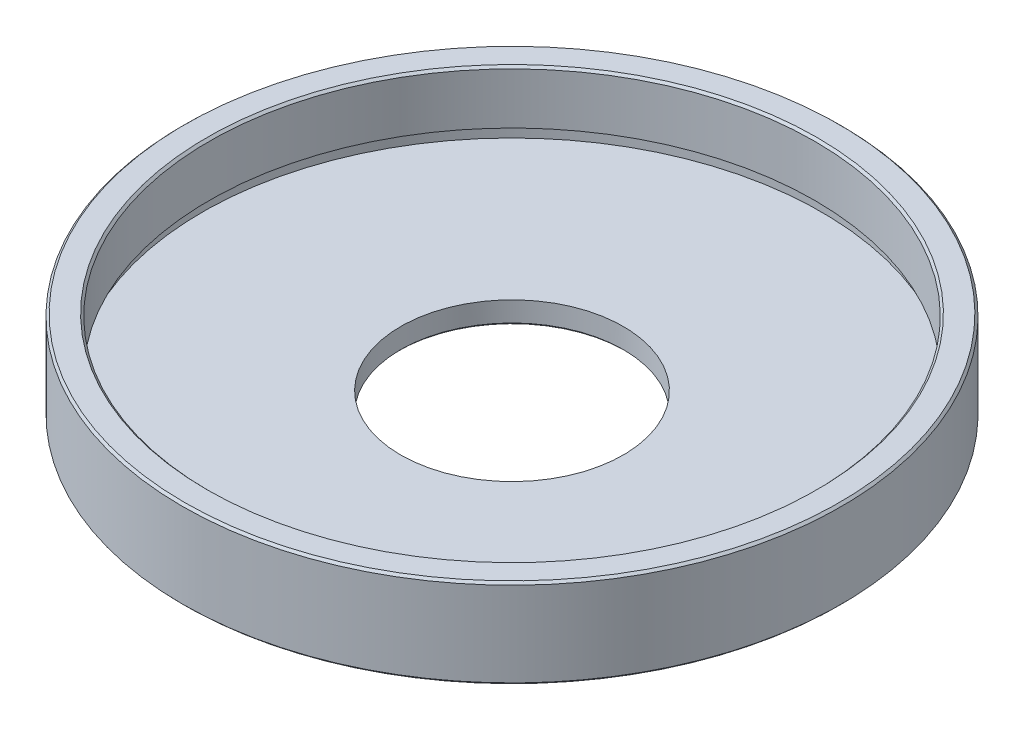
ISO-10303-21;
HEADER;
FILE_DESCRIPTION(('STEP AP214'),'2;1');
FILE_NAME('part.step','',(''),(''),'','','');
FILE_SCHEMA(('AUTOMOTIVE_DESIGN { 1 0 10303 214 1 1 1 1 }'));
ENDSEC;
DATA;
#1=APPLICATION_CONTEXT('core data for automotive mechanical design processes');
#2=APPLICATION_PROTOCOL_DEFINITION('international standard','automotive_design',2000,#1);
#3=PRODUCT_CONTEXT('',#1,'mechanical');
#4=PRODUCT('Part','Part','',(#3));
#5=PRODUCT_RELATED_PRODUCT_CATEGORY('part','',(#4));
#6=PRODUCT_DEFINITION_FORMATION('','',#4);
#7=PRODUCT_DEFINITION_CONTEXT('part definition',#1,'design');
#8=PRODUCT_DEFINITION('design','',#6,#7);
#9=PRODUCT_DEFINITION_SHAPE('','',#8);
#10=(LENGTH_UNIT() NAMED_UNIT(*) SI_UNIT(.MILLI.,.METRE.));
#11=(NAMED_UNIT(*) PLANE_ANGLE_UNIT() SI_UNIT($,.RADIAN.));
#12=(NAMED_UNIT(*) SI_UNIT($,.STERADIAN.) SOLID_ANGLE_UNIT());
#13=UNCERTAINTY_MEASURE_WITH_UNIT(LENGTH_MEASURE(1.E-05),#10,'distance_accuracy_value','');
#14=(GEOMETRIC_REPRESENTATION_CONTEXT(3) GLOBAL_UNCERTAINTY_ASSIGNED_CONTEXT((#13)) GLOBAL_UNIT_ASSIGNED_CONTEXT((#10,
#11,#12)) REPRESENTATION_CONTEXT('',''));
#15=CARTESIAN_POINT('',(0.,0.,0.));
#16=DIRECTION('',(0.,0.,1.));
#17=DIRECTION('',(1.,0.,0.));
#18=AXIS2_PLACEMENT_3D('',#15,#16,#17);
#19=CARTESIAN_POINT('',(68.,20.,-4.74841462082666E-13));
#20=DIRECTION('',(0.,1.,0.));
#21=DIRECTION('',(0.,0.,1.));
#22=AXIS2_PLACEMENT_3D('',#19,#20,#21);
#23=PLANE('',#22);
#24=CARTESIAN_POINT('',(0.,20.,0.));
#25=DIRECTION('',(0.,1.,0.));
#26=DIRECTION('',(0.,0.,1.));
#27=AXIS2_PLACEMENT_3D('',#24,#25,#26);
#28=CIRCLE('',#27,73.5);
#29=CARTESIAN_POINT('',(0.,20.,73.5));
#30=VERTEX_POINT('',#29);
#31=EDGE_CURVE('E42',#30,#30,#28,.T.);
#32=ORIENTED_EDGE('',*,*,#31,.T.);
#33=EDGE_LOOP('',(#32));
#34=FACE_BOUND('',#33,.T.);
#35=CARTESIAN_POINT('',(0.,20.,0.));
#36=DIRECTION('',(0.,1.,0.));
#37=DIRECTION('',(0.,0.,1.));
#38=AXIS2_PLACEMENT_3D('',#35,#36,#37);
#39=CIRCLE('',#38,68.5);
#40=CARTESIAN_POINT('',(0.,20.,68.5));
#41=VERTEX_POINT('',#40);
#42=EDGE_CURVE('E46',#41,#41,#39,.F.);
#43=ORIENTED_EDGE('',*,*,#42,.T.);
#44=EDGE_LOOP('',(#43));
#45=FACE_BOUND('',#44,.T.);
#46=ADVANCED_FACE('F35',(#34,#45),#23,.T.);
#47=CARTESIAN_POINT('',(0.,26.1689859870494,0.));
#48=DIRECTION('',(0.,1.,0.));
#49=DIRECTION('',(0.,0.,1.));
#50=AXIS2_PLACEMENT_3D('',#47,#48,#49);
#51=CYLINDRICAL_SURFACE('',#50,74.);
#52=CARTESIAN_POINT('',(0.,0.500000000000014,0.));
#53=DIRECTION('',(0.,-1.,0.));
#54=DIRECTION('',(0.,0.,-1.));
#55=AXIS2_PLACEMENT_3D('',#52,#53,#54);
#56=CIRCLE('',#55,74.);
#57=CARTESIAN_POINT('',(0.,0.500000000000014,-74.));
#58=VERTEX_POINT('',#57);
#59=EDGE_CURVE('E50',#58,#58,#56,.F.);
#60=ORIENTED_EDGE('',*,*,#59,.T.);
#61=EDGE_LOOP('',(#60));
#62=FACE_BOUND('',#61,.T.);
#63=CARTESIAN_POINT('',(0.,19.5,0.));
#64=DIRECTION('',(0.,1.,0.));
#65=DIRECTION('',(0.,0.,1.));
#66=AXIS2_PLACEMENT_3D('',#63,#64,#65);
#67=CIRCLE('',#66,74.);
#68=CARTESIAN_POINT('',(0.,19.5,74.));
#69=VERTEX_POINT('',#68);
#70=EDGE_CURVE('E55',#69,#69,#67,.F.);
#71=ORIENTED_EDGE('',*,*,#70,.T.);
#72=EDGE_LOOP('',(#71));
#73=FACE_BOUND('',#72,.T.);
#74=ADVANCED_FACE('F97',(#62,#73),#51,.T.);
#75=CARTESIAN_POINT('',(74.,0.,-5.16739238148784E-13));
#76=DIRECTION('',(0.,-1.,0.));
#77=DIRECTION('',(0.,0.,-1.));
#78=AXIS2_PLACEMENT_3D('',#75,#76,#77);
#79=PLANE('',#78);
#80=CARTESIAN_POINT('',(0.,0.,0.));
#81=DIRECTION('',(0.,-1.,0.));
#82=DIRECTION('',(0.,0.,-1.));
#83=AXIS2_PLACEMENT_3D('',#80,#81,#82);
#84=CIRCLE('',#83,25.5);
#85=CARTESIAN_POINT('',(0.,0.,-25.5));
#86=VERTEX_POINT('',#85);
#87=EDGE_CURVE('E61',#86,#86,#84,.F.);
#88=ORIENTED_EDGE('',*,*,#87,.T.);
#89=EDGE_LOOP('',(#88));
#90=FACE_BOUND('',#89,.T.);
#91=CARTESIAN_POINT('',(0.,0.,0.));
#92=DIRECTION('',(0.,-1.,0.));
#93=DIRECTION('',(0.,0.,-1.));
#94=AXIS2_PLACEMENT_3D('',#91,#92,#93);
#95=CIRCLE('',#94,73.5);
#96=CARTESIAN_POINT('',(0.,0.,-73.5));
#97=VERTEX_POINT('',#96);
#98=EDGE_CURVE('E64',#97,#97,#95,.T.);
#99=ORIENTED_EDGE('',*,*,#98,.T.);
#100=EDGE_LOOP('',(#99));
#101=FACE_BOUND('',#100,.T.);
#102=ADVANCED_FACE('F102',(#90,#101),#79,.T.);
#103=CARTESIAN_POINT('',(0.,26.1689859870494,0.));
#104=DIRECTION('',(0.,1.,0.));
#105=DIRECTION('',(0.,0.,1.));
#106=AXIS2_PLACEMENT_3D('',#103,#104,#105);
#107=CYLINDRICAL_SURFACE('',#106,25.);
#108=CARTESIAN_POINT('',(0.,0.500000000000056,0.));
#109=DIRECTION('',(0.,-1.,0.));
#110=DIRECTION('',(0.,0.,-1.));
#111=AXIS2_PLACEMENT_3D('',#108,#109,#110);
#112=CIRCLE('',#111,25.);
#113=CARTESIAN_POINT('',(0.,0.500000000000056,-25.));
#114=VERTEX_POINT('',#113);
#115=EDGE_CURVE('E58',#114,#114,#112,.T.);
#116=ORIENTED_EDGE('',*,*,#115,.T.);
#117=EDGE_LOOP('',(#116));
#118=FACE_BOUND('',#117,.T.);
#119=CARTESIAN_POINT('',(0.,5.,0.));
#120=DIRECTION('',(0.,1.,0.));
#121=DIRECTION('',(0.,0.,1.));
#122=AXIS2_PLACEMENT_3D('',#119,#120,#121);
#123=CIRCLE('',#122,25.);
#124=CARTESIAN_POINT('',(0.,5.,25.));
#125=VERTEX_POINT('',#124);
#126=EDGE_CURVE('E67',#125,#125,#123,.T.);
#127=ORIENTED_EDGE('',*,*,#126,.T.);
#128=EDGE_LOOP('',(#127));
#129=FACE_BOUND('',#128,.T.);
#130=ADVANCED_FACE('F153',(#118,#129),#107,.F.);
#131=CARTESIAN_POINT('',(25.,5.,-1.74574066942157E-13));
#132=DIRECTION('',(0.,1.,0.));
#133=DIRECTION('',(0.,0.,1.));
#134=AXIS2_PLACEMENT_3D('',#131,#132,#133);
#135=PLANE('',#134);
#136=CARTESIAN_POINT('',(0.,4.99999999999999,0.));
#137=DIRECTION('',(0.,1.,0.));
#138=DIRECTION('',(0.,0.,1.));
#139=AXIS2_PLACEMENT_3D('',#136,#137,#138);
#140=CIRCLE('',#139,69.5);
#141=CARTESIAN_POINT('',(0.,4.99999999999999,69.5));
#142=VERTEX_POINT('',#141);
#143=EDGE_CURVE('E70',#142,#142,#140,.T.);
#144=ORIENTED_EDGE('',*,*,#143,.T.);
#145=EDGE_LOOP('',(#144));
#146=FACE_BOUND('',#145,.T.);
#147=ORIENTED_EDGE('',*,*,#126,.F.);
#148=EDGE_LOOP('',(#147));
#149=FACE_BOUND('',#148,.T.);
#150=ADVANCED_FACE('F158',(#146,#149),#135,.T.);
#151=CARTESIAN_POINT('',(0.,26.1689859870494,0.));
#152=DIRECTION('',(0.,1.,0.));
#153=DIRECTION('',(0.,0.,1.));
#154=AXIS2_PLACEMENT_3D('',#151,#152,#153);
#155=CYLINDRICAL_SURFACE('',#154,69.5);
#156=CARTESIAN_POINT('',(0.,8.,0.));
#157=DIRECTION('',(0.,1.,0.));
#158=DIRECTION('',(0.,0.,1.));
#159=AXIS2_PLACEMENT_3D('',#156,#157,#158);
#160=CIRCLE('',#159,69.5);
#161=CARTESIAN_POINT('',(0.,8.,69.5));
#162=VERTEX_POINT('',#161);
#163=EDGE_CURVE('E73',#162,#162,#160,.T.);
#164=ORIENTED_EDGE('',*,*,#163,.T.);
#165=EDGE_LOOP('',(#164));
#166=FACE_BOUND('',#165,.T.);
#167=ORIENTED_EDGE('',*,*,#143,.F.);
#168=EDGE_LOOP('',(#167));
#169=FACE_BOUND('',#168,.T.);
#170=ADVANCED_FACE('F94',(#166,#169),#155,.F.);
#171=CARTESIAN_POINT('',(69.5,8.,-4.85315906099195E-13));
#172=DIRECTION('',(0.,-1.,0.));
#173=DIRECTION('',(0.,0.,-1.));
#174=AXIS2_PLACEMENT_3D('',#171,#172,#173);
#175=PLANE('',#174);
#176=CARTESIAN_POINT('',(0.,8.,0.));
#177=DIRECTION('',(0.,1.,0.));
#178=DIRECTION('',(0.,0.,1.));
#179=AXIS2_PLACEMENT_3D('',#176,#177,#178);
#180=CIRCLE('',#179,68.);
#181=CARTESIAN_POINT('',(0.,8.,68.));
#182=VERTEX_POINT('',#181);
#183=EDGE_CURVE('E76',#182,#182,#180,.T.);
#184=ORIENTED_EDGE('',*,*,#183,.T.);
#185=EDGE_LOOP('',(#184));
#186=FACE_BOUND('',#185,.T.);
#187=ORIENTED_EDGE('',*,*,#163,.F.);
#188=EDGE_LOOP('',(#187));
#189=FACE_BOUND('',#188,.T.);
#190=ADVANCED_FACE('F80',(#186,#189),#175,.T.);
#191=CARTESIAN_POINT('',(0.,26.1689859870494,0.));
#192=DIRECTION('',(0.,1.,0.));
#193=DIRECTION('',(0.,0.,1.));
#194=AXIS2_PLACEMENT_3D('',#191,#192,#193);
#195=CYLINDRICAL_SURFACE('',#194,68.);
#196=CARTESIAN_POINT('',(0.,19.5,0.));
#197=DIRECTION('',(0.,1.,0.));
#198=DIRECTION('',(0.,0.,1.));
#199=AXIS2_PLACEMENT_3D('',#196,#197,#198);
#200=CIRCLE('',#199,68.);
#201=CARTESIAN_POINT('',(0.,19.5,68.));
#202=VERTEX_POINT('',#201);
#203=EDGE_CURVE('E10',#202,#202,#200,.T.);
#204=ORIENTED_EDGE('',*,*,#203,.T.);
#205=EDGE_LOOP('',(#204));
#206=FACE_BOUND('',#205,.T.);
#207=ORIENTED_EDGE('',*,*,#183,.F.);
#208=EDGE_LOOP('',(#207));
#209=FACE_BOUND('',#208,.T.);
#210=ADVANCED_FACE('F83',(#206,#209),#195,.F.);
#211=CARTESIAN_POINT('',(0.,0.,0.));
#212=DIRECTION('',(0.,-1.,0.));
#213=DIRECTION('',(0.,0.,-1.));
#214=AXIS2_PLACEMENT_3D('',#211,#212,#213);
#215=CONICAL_SURFACE('',#214,25.5,0.785398163397421);
#216=ORIENTED_EDGE('',*,*,#115,.F.);
#217=EDGE_LOOP('',(#216));
#218=FACE_BOUND('',#217,.T.);
#219=ORIENTED_EDGE('',*,*,#87,.F.);
#220=EDGE_LOOP('',(#219));
#221=FACE_BOUND('',#220,.T.);
#222=ADVANCED_FACE('F85',(#218,#221),#215,.F.);
#223=CARTESIAN_POINT('',(0.,0.500000000000014,0.));
#224=DIRECTION('',(0.,1.,0.));
#225=DIRECTION('',(0.,0.,1.));
#226=AXIS2_PLACEMENT_3D('',#223,#224,#225);
#227=CONICAL_SURFACE('',#226,74.,0.785398163397421);
#228=ORIENTED_EDGE('',*,*,#98,.F.);
#229=EDGE_LOOP('',(#228));
#230=FACE_BOUND('',#229,.T.);
#231=ORIENTED_EDGE('',*,*,#59,.F.);
#232=EDGE_LOOP('',(#231));
#233=FACE_BOUND('',#232,.T.);
#234=ADVANCED_FACE('F91',(#230,#233),#227,.T.);
#235=CARTESIAN_POINT('',(0.,20.,0.));
#236=DIRECTION('',(0.,-1.,0.));
#237=DIRECTION('',(0.,0.,-1.));
#238=AXIS2_PLACEMENT_3D('',#235,#236,#237);
#239=CONICAL_SURFACE('',#238,73.5,0.785398163397476);
#240=ORIENTED_EDGE('',*,*,#70,.F.);
#241=EDGE_LOOP('',(#240));
#242=FACE_BOUND('',#241,.T.);
#243=ORIENTED_EDGE('',*,*,#31,.F.);
#244=EDGE_LOOP('',(#243));
#245=FACE_BOUND('',#244,.T.);
#246=ADVANCED_FACE('F109',(#242,#245),#239,.T.);
#247=CARTESIAN_POINT('',(0.,19.5,0.));
#248=DIRECTION('',(0.,1.,0.));
#249=DIRECTION('',(0.,0.,1.));
#250=AXIS2_PLACEMENT_3D('',#247,#248,#249);
#251=CONICAL_SURFACE('',#250,68.,0.785398163397435);
#252=ORIENTED_EDGE('',*,*,#42,.F.);
#253=EDGE_LOOP('',(#252));
#254=FACE_BOUND('',#253,.T.);
#255=ORIENTED_EDGE('',*,*,#203,.F.);
#256=EDGE_LOOP('',(#255));
#257=FACE_BOUND('',#256,.T.);
#258=ADVANCED_FACE('F37',(#254,#257),#251,.F.);
#259=CLOSED_SHELL('',(#46,#74,#102,#130,#150,#170,#190,#210,#222,#234,#246,#258));
#260=MANIFOLD_SOLID_BREP('B2',#259);
#261=ADVANCED_BREP_SHAPE_REPRESENTATION('',(#18,#260),#14);
#262=SHAPE_DEFINITION_REPRESENTATION(#9,#261);
ENDSEC;
END-ISO-10303-21;
